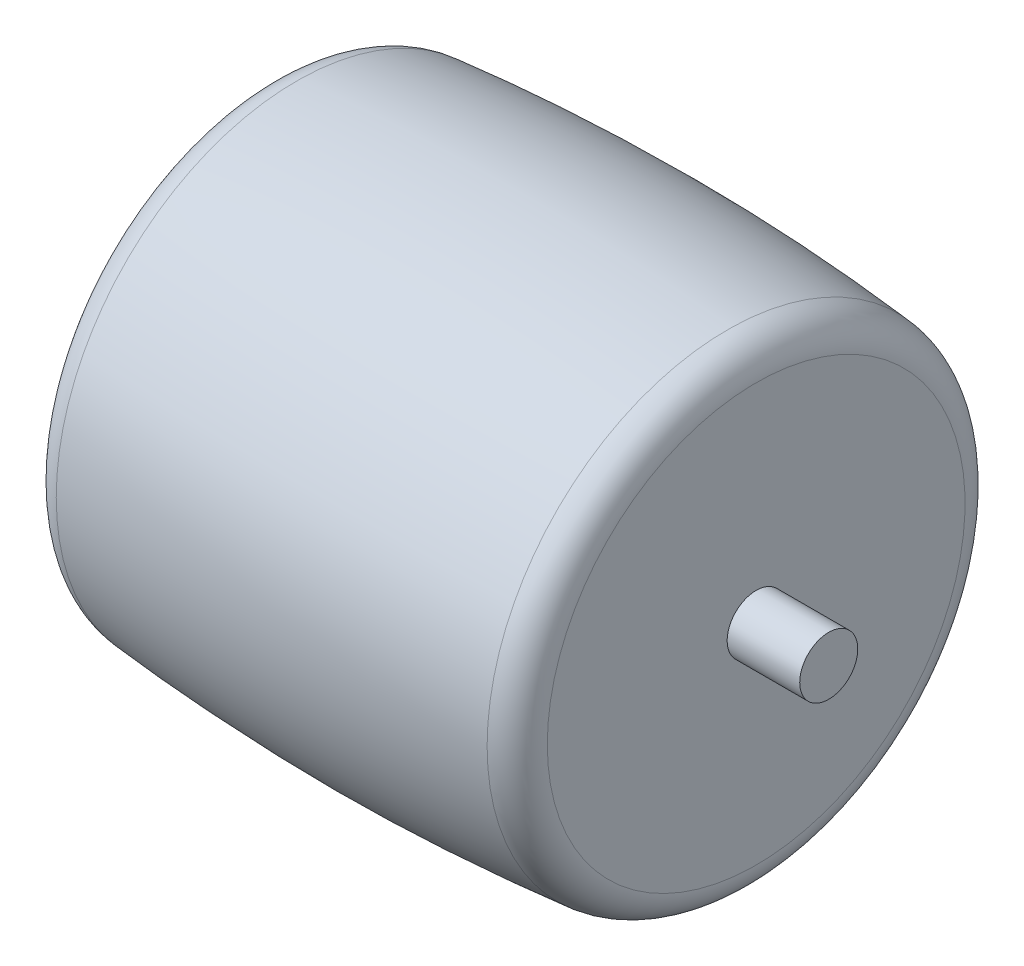
ISO-10303-21;
HEADER;
FILE_DESCRIPTION(('STEP AP214'),'2;1');
FILE_NAME('part.step','',(''),(''),'','','');
FILE_SCHEMA(('AUTOMOTIVE_DESIGN { 1 0 10303 214 1 1 1 1 }'));
ENDSEC;
DATA;
#1=APPLICATION_CONTEXT('core data for automotive mechanical design processes');
#2=APPLICATION_PROTOCOL_DEFINITION('international standard','automotive_design',2000,#1);
#3=PRODUCT_CONTEXT('',#1,'mechanical');
#4=PRODUCT('Part','Part','',(#3));
#5=PRODUCT_RELATED_PRODUCT_CATEGORY('part','',(#4));
#6=PRODUCT_DEFINITION_FORMATION('','',#4);
#7=PRODUCT_DEFINITION_CONTEXT('part definition',#1,'design');
#8=PRODUCT_DEFINITION('design','',#6,#7);
#9=PRODUCT_DEFINITION_SHAPE('','',#8);
#10=(LENGTH_UNIT() NAMED_UNIT(*) SI_UNIT(.MILLI.,.METRE.));
#11=(NAMED_UNIT(*) PLANE_ANGLE_UNIT() SI_UNIT($,.RADIAN.));
#12=(NAMED_UNIT(*) SI_UNIT($,.STERADIAN.) SOLID_ANGLE_UNIT());
#13=UNCERTAINTY_MEASURE_WITH_UNIT(LENGTH_MEASURE(1.E-05),#10,'distance_accuracy_value','');
#14=(GEOMETRIC_REPRESENTATION_CONTEXT(3) GLOBAL_UNCERTAINTY_ASSIGNED_CONTEXT((#13)) GLOBAL_UNIT_ASSIGNED_CONTEXT((#10,
#11,#12)) REPRESENTATION_CONTEXT('',''));
#15=CARTESIAN_POINT('',(0.,0.,0.));
#16=DIRECTION('',(0.,0.,1.));
#17=DIRECTION('',(1.,0.,0.));
#18=AXIS2_PLACEMENT_3D('',#15,#16,#17);
#19=CARTESIAN_POINT('',(-12.,0.,-1.1));
#20=DIRECTION('',(1.,0.,0.));
#21=DIRECTION('',(0.,0.,-1.));
#22=AXIS2_PLACEMENT_3D('',#19,#20,#21);
#23=PLANE('',#22);
#24=CARTESIAN_POINT('',(-12.,0.,0.));
#25=DIRECTION('',(-1.,0.,0.));
#26=DIRECTION('',(0.,0.,1.));
#27=AXIS2_PLACEMENT_3D('',#24,#25,#26);
#28=CIRCLE('',#27,1.1);
#29=CARTESIAN_POINT('',(-12.,0.,1.1));
#30=VERTEX_POINT('',#29);
#31=EDGE_CURVE('E60',#30,#30,#28,.T.);
#32=ORIENTED_EDGE('',*,*,#31,.T.);
#33=EDGE_LOOP('',(#32));
#34=FACE_BOUND('',#33,.T.);
#35=ADVANCED_FACE('F32',(#34),#23,.F.);
#36=CARTESIAN_POINT('',(12.,0.,0.));
#37=DIRECTION('',(-1.,0.,0.));
#38=DIRECTION('',(0.,0.,1.));
#39=AXIS2_PLACEMENT_3D('',#36,#37,#38);
#40=PLANE('',#39);
#41=CARTESIAN_POINT('',(12.,0.,0.));
#42=DIRECTION('',(-1.,0.,0.));
#43=DIRECTION('',(0.,0.,1.));
#44=AXIS2_PLACEMENT_3D('',#41,#42,#43);
#45=CIRCLE('',#44,1.1);
#46=CARTESIAN_POINT('',(12.,0.,1.1));
#47=VERTEX_POINT('',#46);
#48=EDGE_CURVE('E10',#47,#47,#45,.T.);
#49=ORIENTED_EDGE('',*,*,#48,.F.);
#50=EDGE_LOOP('',(#49));
#51=FACE_BOUND('',#50,.T.);
#52=ADVANCED_FACE('F87',(#51),#40,.F.);
#53=CARTESIAN_POINT('',(-12.,0.,0.));
#54=DIRECTION('',(-1.,0.,0.));
#55=DIRECTION('',(0.,0.,1.));
#56=AXIS2_PLACEMENT_3D('',#53,#54,#55);
#57=CYLINDRICAL_SURFACE('',#56,1.1);
#58=CARTESIAN_POINT('',(9.25,0.,0.));
#59=DIRECTION('',(-1.,0.,0.));
#60=DIRECTION('',(0.,0.,1.));
#61=AXIS2_PLACEMENT_3D('',#58,#59,#60);
#62=CIRCLE('',#61,1.1);
#63=CARTESIAN_POINT('',(9.25,0.,1.1));
#64=VERTEX_POINT('',#63);
#65=EDGE_CURVE('E38',#64,#64,#62,.T.);
#66=ORIENTED_EDGE('',*,*,#65,.F.);
#67=EDGE_LOOP('',(#66));
#68=FACE_BOUND('',#67,.T.);
#69=ORIENTED_EDGE('',*,*,#48,.T.);
#70=EDGE_LOOP('',(#69));
#71=FACE_BOUND('',#70,.T.);
#72=ADVANCED_FACE('F84',(#68,#71),#57,.T.);
#73=CARTESIAN_POINT('',(9.25,0.,-1.1));
#74=DIRECTION('',(-1.,0.,0.));
#75=DIRECTION('',(0.,0.,1.));
#76=AXIS2_PLACEMENT_3D('',#73,#74,#75);
#77=PLANE('',#76);
#78=CARTESIAN_POINT('',(9.25,0.,0.));
#79=DIRECTION('',(-1.,0.,0.));
#80=DIRECTION('',(0.,0.,1.));
#81=AXIS2_PLACEMENT_3D('',#78,#79,#80);
#82=CIRCLE('',#81,7.91594066368154);
#83=CARTESIAN_POINT('',(9.25,0.,7.91594066368154));
#84=VERTEX_POINT('',#83);
#85=EDGE_CURVE('E42',#84,#84,#82,.T.);
#86=ORIENTED_EDGE('',*,*,#85,.F.);
#87=EDGE_LOOP('',(#86));
#88=FACE_BOUND('',#87,.T.);
#89=ORIENTED_EDGE('',*,*,#65,.T.);
#90=EDGE_LOOP('',(#89));
#91=FACE_BOUND('',#90,.T.);
#92=ADVANCED_FACE('F80',(#88,#91),#77,.F.);
#93=CARTESIAN_POINT('',(8.05,0.,0.));
#94=DIRECTION('',(-1.,0.,0.));
#95=DIRECTION('',(0.,0.,1.));
#96=AXIS2_PLACEMENT_3D('',#93,#94,#95);
#97=TOROIDAL_SURFACE('',#96,7.91594066368154,1.2);
#98=CARTESIAN_POINT('',(8.16408138108478,0.,0.));
#99=DIRECTION('',(-1.,0.,0.));
#100=DIRECTION('',(0.,0.,1.));
#101=AXIS2_PLACEMENT_3D('',#98,#99,#100);
#102=CIRCLE('',#101,9.11050562151757);
#103=CARTESIAN_POINT('',(8.16408138108478,0.,9.11050562151757));
#104=VERTEX_POINT('',#103);
#105=EDGE_CURVE('E46',#104,#104,#102,.T.);
#106=ORIENTED_EDGE('',*,*,#105,.F.);
#107=EDGE_LOOP('',(#106));
#108=FACE_BOUND('',#107,.T.);
#109=ORIENTED_EDGE('',*,*,#85,.T.);
#110=EDGE_LOOP('',(#109));
#111=FACE_BOUND('',#110,.T.);
#112=ADVANCED_FACE('F75',(#108,#111),#97,.T.);
#113=CARTESIAN_POINT('',(8.16408138108478,0.,-9.11050562151757));
#114=CARTESIAN_POINT('',(5.53537005207304,0.,-9.36154849442262));
#115=CARTESIAN_POINT('',(0.0261540390430306,0.,-9.64096888948899));
#116=CARTESIAN_POINT('',(-5.5876113187668,0.,-9.35651375684618));
#117=CARTESIAN_POINT('',(-8.16403161735801,0.,-9.11057300398014));
#118=B_SPLINE_CURVE_WITH_KNOTS('',3,(#113,#114,#115,#116,#117),.UNSPECIFIED.,.F.,.F.,(4,1,4),
(0.0587037395472292,0.4999849588138,0.941263527484931),.UNSPECIFIED.);
#119=CARTESIAN_POINT('',(-12.,0.,0.));
#120=DIRECTION('',(-1.,0.,0.));
#121=AXIS1_PLACEMENT('',#119,#120);
#122=SURFACE_OF_REVOLUTION('',#118,#121);
#123=CARTESIAN_POINT('',(-8.16403161735801,0.,0.));
#124=DIRECTION('',(-1.,0.,0.));
#125=DIRECTION('',(0.,0.,1.));
#126=AXIS2_PLACEMENT_3D('',#123,#124,#125);
#127=CIRCLE('',#126,9.11057300398014);
#128=CARTESIAN_POINT('',(-8.16403161735801,0.,9.11057300398014));
#129=VERTEX_POINT('',#128);
#130=EDGE_CURVE('E51',#129,#129,#127,.T.);
#131=ORIENTED_EDGE('',*,*,#130,.F.);
#132=EDGE_LOOP('',(#131));
#133=FACE_BOUND('',#132,.T.);
#134=ORIENTED_EDGE('',*,*,#105,.T.);
#135=EDGE_LOOP('',(#134));
#136=FACE_BOUND('',#135,.T.);
#137=ADVANCED_FACE('F70',(#133,#136),#122,.T.);
#138=CARTESIAN_POINT('',(-8.05,0.,0.));
#139=DIRECTION('',(-1.,0.,0.));
#140=DIRECTION('',(0.,0.,1.));
#141=AXIS2_PLACEMENT_3D('',#138,#139,#140);
#142=TOROIDAL_SURFACE('',#141,7.91600329473639,1.2);
#143=CARTESIAN_POINT('',(-9.24999999999999,0.,0.));
#144=DIRECTION('',(-1.,0.,0.));
#145=DIRECTION('',(0.,0.,1.));
#146=AXIS2_PLACEMENT_3D('',#143,#144,#145);
#147=CIRCLE('',#146,7.91600329473639);
#148=CARTESIAN_POINT('',(-9.24999999999999,0.,7.91600329473639));
#149=VERTEX_POINT('',#148);
#150=EDGE_CURVE('E54',#149,#149,#147,.T.);
#151=ORIENTED_EDGE('',*,*,#150,.F.);
#152=EDGE_LOOP('',(#151));
#153=FACE_BOUND('',#152,.T.);
#154=ORIENTED_EDGE('',*,*,#130,.T.);
#155=EDGE_LOOP('',(#154));
#156=FACE_BOUND('',#155,.T.);
#157=ADVANCED_FACE('F74',(#153,#156),#142,.T.);
#158=CARTESIAN_POINT('',(-9.24999999999999,0.,-7.91600329473639));
#159=DIRECTION('',(1.,0.,0.));
#160=DIRECTION('',(0.,0.,-1.));
#161=AXIS2_PLACEMENT_3D('',#158,#159,#160);
#162=PLANE('',#161);
#163=CARTESIAN_POINT('',(-9.25,0.,0.));
#164=DIRECTION('',(-1.,0.,0.));
#165=DIRECTION('',(0.,0.,1.));
#166=AXIS2_PLACEMENT_3D('',#163,#164,#165);
#167=CIRCLE('',#166,1.1);
#168=CARTESIAN_POINT('',(-9.25,0.,1.1));
#169=VERTEX_POINT('',#168);
#170=EDGE_CURVE('E57',#169,#169,#167,.T.);
#171=ORIENTED_EDGE('',*,*,#170,.F.);
#172=EDGE_LOOP('',(#171));
#173=FACE_BOUND('',#172,.T.);
#174=ORIENTED_EDGE('',*,*,#150,.T.);
#175=EDGE_LOOP('',(#174));
#176=FACE_BOUND('',#175,.T.);
#177=ADVANCED_FACE('F102',(#173,#176),#162,.F.);
#178=CARTESIAN_POINT('',(-12.,0.,0.));
#179=DIRECTION('',(-1.,0.,0.));
#180=DIRECTION('',(0.,0.,1.));
#181=AXIS2_PLACEMENT_3D('',#178,#179,#180);
#182=CYLINDRICAL_SURFACE('',#181,1.1);
#183=ORIENTED_EDGE('',*,*,#31,.F.);
#184=EDGE_LOOP('',(#183));
#185=FACE_BOUND('',#184,.T.);
#186=ORIENTED_EDGE('',*,*,#170,.T.);
#187=EDGE_LOOP('',(#186));
#188=FACE_BOUND('',#187,.T.);
#189=ADVANCED_FACE('F99',(#185,#188),#182,.T.);
#190=CLOSED_SHELL('',(#35,#52,#72,#92,#112,#137,#157,#177,#189));
#191=MANIFOLD_SOLID_BREP('B2',#190);
#192=ADVANCED_BREP_SHAPE_REPRESENTATION('',(#18,#191),#14);
#193=SHAPE_DEFINITION_REPRESENTATION(#9,#192);
ENDSEC;
END-ISO-10303-21;
